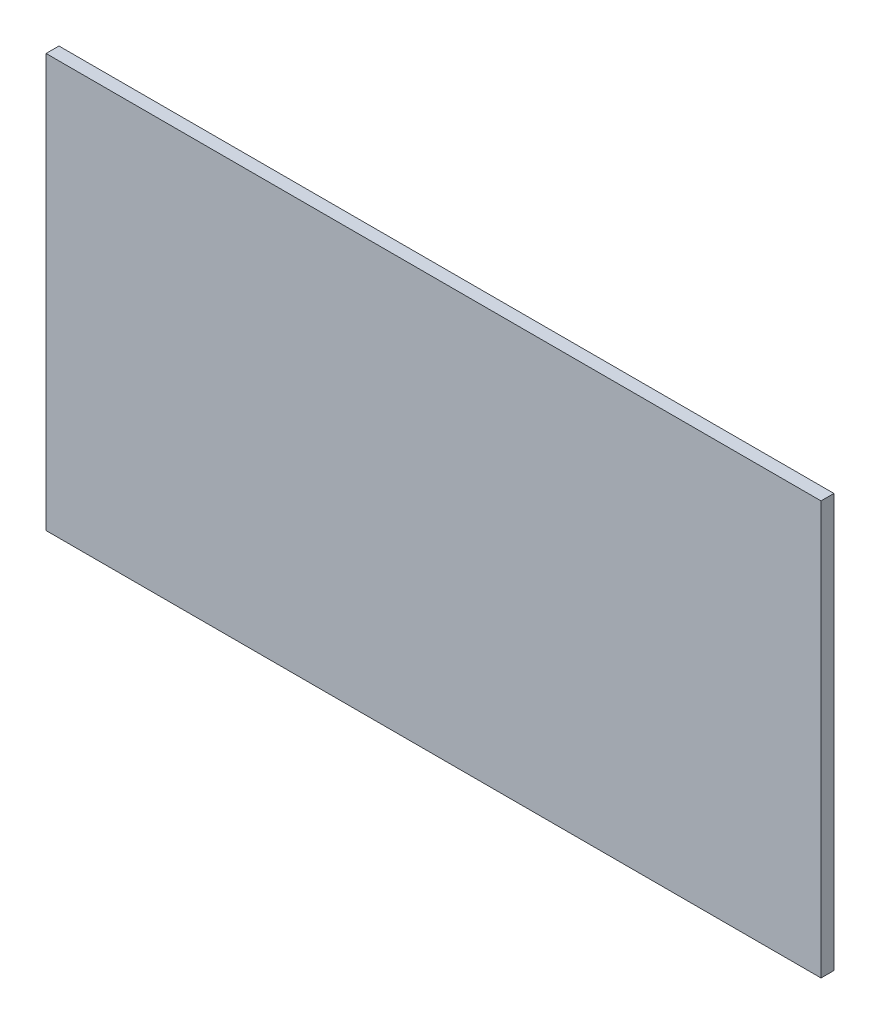
ISO-10303-21;
HEADER;
FILE_DESCRIPTION(('STEP AP214'),'2;1');
FILE_NAME('part.step','',(''),(''),'','','');
FILE_SCHEMA(('AUTOMOTIVE_DESIGN { 1 0 10303 214 1 1 1 1 }'));
ENDSEC;
DATA;
#1=APPLICATION_CONTEXT('core data for automotive mechanical design processes');
#2=APPLICATION_PROTOCOL_DEFINITION('international standard','automotive_design',2000,#1);
#3=PRODUCT_CONTEXT('',#1,'mechanical');
#4=PRODUCT('Part','Part','',(#3));
#5=PRODUCT_RELATED_PRODUCT_CATEGORY('part','',(#4));
#6=PRODUCT_DEFINITION_FORMATION('','',#4);
#7=PRODUCT_DEFINITION_CONTEXT('part definition',#1,'design');
#8=PRODUCT_DEFINITION('design','',#6,#7);
#9=PRODUCT_DEFINITION_SHAPE('','',#8);
#10=(LENGTH_UNIT() NAMED_UNIT(*) SI_UNIT(.MILLI.,.METRE.));
#11=(NAMED_UNIT(*) PLANE_ANGLE_UNIT() SI_UNIT($,.RADIAN.));
#12=(NAMED_UNIT(*) SI_UNIT($,.STERADIAN.) SOLID_ANGLE_UNIT());
#13=UNCERTAINTY_MEASURE_WITH_UNIT(LENGTH_MEASURE(1.E-05),#10,'distance_accuracy_value','');
#14=(GEOMETRIC_REPRESENTATION_CONTEXT(3) GLOBAL_UNCERTAINTY_ASSIGNED_CONTEXT((#13)) GLOBAL_UNIT_ASSIGNED_CONTEXT((#10,
#11,#12)) REPRESENTATION_CONTEXT('',''));
#15=CARTESIAN_POINT('',(0.,0.,0.));
#16=DIRECTION('',(0.,0.,1.));
#17=DIRECTION('',(1.,0.,0.));
#18=AXIS2_PLACEMENT_3D('',#15,#16,#17);
#19=CARTESIAN_POINT('',(0.,0.,0.));
#20=DIRECTION('',(0.,0.,-1.));
#21=DIRECTION('',(-1.,0.,0.));
#22=AXIS2_PLACEMENT_3D('',#19,#20,#21);
#23=PLANE('',#22);
#24=DIRECTION('',(0.,-1.,0.));
#25=VECTOR('',#24,1.);
#26=CARTESIAN_POINT('',(0.,0.,0.));
#27=LINE('',#26,#25);
#28=CARTESIAN_POINT('',(0.,80.,0.));
#29=VERTEX_POINT('',#28);
#30=CARTESIAN_POINT('',(0.,0.,0.));
#31=VERTEX_POINT('',#30);
#32=EDGE_CURVE('E134',#29,#31,#27,.T.);
#33=ORIENTED_EDGE('',*,*,#32,.F.);
#34=DIRECTION('',(-1.,0.,0.));
#35=VECTOR('',#34,1.);
#36=CARTESIAN_POINT('',(0.,80.,0.));
#37=LINE('',#36,#35);
#38=CARTESIAN_POINT('',(150.05,80.,0.));
#39=VERTEX_POINT('',#38);
#40=EDGE_CURVE('E80',#39,#29,#37,.T.);
#41=ORIENTED_EDGE('',*,*,#40,.F.);
#42=DIRECTION('',(0.,1.,0.));
#43=VECTOR('',#42,1.);
#44=CARTESIAN_POINT('',(150.05,0.,0.));
#45=LINE('',#44,#43);
#46=CARTESIAN_POINT('',(150.05,0.,0.));
#47=VERTEX_POINT('',#46);
#48=EDGE_CURVE('E150',#47,#39,#45,.T.);
#49=ORIENTED_EDGE('',*,*,#48,.F.);
#50=DIRECTION('',(1.,0.,0.));
#51=VECTOR('',#50,1.);
#52=CARTESIAN_POINT('',(0.,0.,0.));
#53=LINE('',#52,#51);
#54=EDGE_CURVE('E137',#31,#47,#53,.T.);
#55=ORIENTED_EDGE('',*,*,#54,.F.);
#56=EDGE_LOOP('',(#33,#41,#49,#55));
#57=FACE_BOUND('',#56,.T.);
#58=DIRECTION('',(1.,0.,0.));
#59=VECTOR('',#58,1.);
#60=CARTESIAN_POINT('',(60.025,16.7265474439847,0.));
#61=LINE('',#60,#59);
#62=CARTESIAN_POINT('',(60.025,16.7265474439847,0.));
#63=VERTEX_POINT('',#62);
#64=CARTESIAN_POINT('',(90.025,16.7265474439847,0.));
#65=VERTEX_POINT('',#64);
#66=EDGE_CURVE('E265',#63,#65,#61,.T.);
#67=ORIENTED_EDGE('',*,*,#66,.F.);
#68=DIRECTION('',(0.,1.,0.));
#69=VECTOR('',#68,1.);
#70=CARTESIAN_POINT('',(60.025,11.7265474439847,0.));
#71=LINE('',#70,#69);
#72=CARTESIAN_POINT('',(60.025,11.7265474439847,0.));
#73=VERTEX_POINT('',#72);
#74=EDGE_CURVE('E132',#73,#63,#71,.T.);
#75=ORIENTED_EDGE('',*,*,#74,.F.);
#76=DIRECTION('',(-1.,0.,0.));
#77=VECTOR('',#76,1.);
#78=CARTESIAN_POINT('',(60.025,11.7265474439847,0.));
#79=LINE('',#78,#77);
#80=CARTESIAN_POINT('',(90.025,11.7265474439847,0.));
#81=VERTEX_POINT('',#80);
#82=EDGE_CURVE('E128',#81,#73,#79,.T.);
#83=ORIENTED_EDGE('',*,*,#82,.F.);
#84=DIRECTION('',(0.,-1.,0.));
#85=VECTOR('',#84,1.);
#86=CARTESIAN_POINT('',(90.025,11.7265474439847,0.));
#87=LINE('',#86,#85);
#88=EDGE_CURVE('E262',#65,#81,#87,.T.);
#89=ORIENTED_EDGE('',*,*,#88,.F.);
#90=EDGE_LOOP('',(#67,#75,#83,#89));
#91=FACE_BOUND('',#90,.T.);
#92=ADVANCED_FACE('F35',(#57,#91),#23,.T.);
#93=CARTESIAN_POINT('',(0.,0.,2.5));
#94=DIRECTION('',(1.,0.,0.));
#95=DIRECTION('',(0.,0.,-1.));
#96=AXIS2_PLACEMENT_3D('',#93,#94,#95);
#97=PLANE('',#96);
#98=ORIENTED_EDGE('',*,*,#32,.T.);
#99=DIRECTION('',(0.,0.,-1.));
#100=VECTOR('',#99,1.);
#101=CARTESIAN_POINT('',(0.,0.,2.5));
#102=LINE('',#101,#100);
#103=CARTESIAN_POINT('',(0.,0.,2.5));
#104=VERTEX_POINT('',#103);
#105=EDGE_CURVE('E11',#104,#31,#102,.T.);
#106=ORIENTED_EDGE('',*,*,#105,.F.);
#107=DIRECTION('',(0.,-1.,0.));
#108=VECTOR('',#107,1.);
#109=CARTESIAN_POINT('',(0.,0.,2.5));
#110=LINE('',#109,#108);
#111=CARTESIAN_POINT('',(0.,80.,2.5));
#112=VERTEX_POINT('',#111);
#113=EDGE_CURVE('E142',#112,#104,#110,.T.);
#114=ORIENTED_EDGE('',*,*,#113,.F.);
#115=DIRECTION('',(0.,0.,-1.));
#116=VECTOR('',#115,1.);
#117=CARTESIAN_POINT('',(0.,80.,2.5));
#118=LINE('',#117,#116);
#119=EDGE_CURVE('E147',#112,#29,#118,.T.);
#120=ORIENTED_EDGE('',*,*,#119,.T.);
#121=EDGE_LOOP('',(#98,#106,#114,#120));
#122=FACE_BOUND('',#121,.T.);
#123=ADVANCED_FACE('F37',(#122),#97,.F.);
#124=CARTESIAN_POINT('',(0.,0.,2.5));
#125=DIRECTION('',(0.,1.,0.));
#126=DIRECTION('',(0.,0.,1.));
#127=AXIS2_PLACEMENT_3D('',#124,#125,#126);
#128=PLANE('',#127);
#129=ORIENTED_EDGE('',*,*,#54,.T.);
#130=DIRECTION('',(0.,0.,-1.));
#131=VECTOR('',#130,1.);
#132=CARTESIAN_POINT('',(150.05,0.,2.5));
#133=LINE('',#132,#131);
#134=CARTESIAN_POINT('',(150.05,0.,2.5));
#135=VERTEX_POINT('',#134);
#136=EDGE_CURVE('E43',#135,#47,#133,.T.);
#137=ORIENTED_EDGE('',*,*,#136,.F.);
#138=DIRECTION('',(1.,0.,0.));
#139=VECTOR('',#138,1.);
#140=CARTESIAN_POINT('',(0.,0.,2.5));
#141=LINE('',#140,#139);
#142=EDGE_CURVE('E87',#104,#135,#141,.T.);
#143=ORIENTED_EDGE('',*,*,#142,.F.);
#144=ORIENTED_EDGE('',*,*,#105,.T.);
#145=EDGE_LOOP('',(#129,#137,#143,#144));
#146=FACE_BOUND('',#145,.T.);
#147=ADVANCED_FACE('F176',(#146),#128,.F.);
#148=CARTESIAN_POINT('',(150.05,0.,2.5));
#149=DIRECTION('',(-1.,0.,0.));
#150=DIRECTION('',(0.,0.,1.));
#151=AXIS2_PLACEMENT_3D('',#148,#149,#150);
#152=PLANE('',#151);
#153=ORIENTED_EDGE('',*,*,#48,.T.);
#154=DIRECTION('',(0.,0.,-1.));
#155=VECTOR('',#154,1.);
#156=CARTESIAN_POINT('',(150.05,80.,2.5));
#157=LINE('',#156,#155);
#158=CARTESIAN_POINT('',(150.05,80.,2.5));
#159=VERTEX_POINT('',#158);
#160=EDGE_CURVE('E154',#159,#39,#157,.T.);
#161=ORIENTED_EDGE('',*,*,#160,.F.);
#162=DIRECTION('',(0.,1.,0.));
#163=VECTOR('',#162,1.);
#164=CARTESIAN_POINT('',(150.05,0.,2.5));
#165=LINE('',#164,#163);
#166=EDGE_CURVE('E145',#135,#159,#165,.T.);
#167=ORIENTED_EDGE('',*,*,#166,.F.);
#168=ORIENTED_EDGE('',*,*,#136,.T.);
#169=EDGE_LOOP('',(#153,#161,#167,#168));
#170=FACE_BOUND('',#169,.T.);
#171=ADVANCED_FACE('F159',(#170),#152,.F.);
#172=CARTESIAN_POINT('',(0.,80.,2.5));
#173=DIRECTION('',(0.,-1.,0.));
#174=DIRECTION('',(0.,0.,-1.));
#175=AXIS2_PLACEMENT_3D('',#172,#173,#174);
#176=PLANE('',#175);
#177=ORIENTED_EDGE('',*,*,#40,.T.);
#178=ORIENTED_EDGE('',*,*,#119,.F.);
#179=DIRECTION('',(-1.,0.,0.));
#180=VECTOR('',#179,1.);
#181=CARTESIAN_POINT('',(0.,80.,2.5));
#182=LINE('',#181,#180);
#183=EDGE_CURVE('E59',#159,#112,#182,.T.);
#184=ORIENTED_EDGE('',*,*,#183,.F.);
#185=ORIENTED_EDGE('',*,*,#160,.T.);
#186=EDGE_LOOP('',(#177,#178,#184,#185));
#187=FACE_BOUND('',#186,.T.);
#188=ADVANCED_FACE('F167',(#187),#176,.F.);
#189=CARTESIAN_POINT('',(0.,0.,2.5));
#190=DIRECTION('',(0.,0.,-1.));
#191=DIRECTION('',(-1.,0.,0.));
#192=AXIS2_PLACEMENT_3D('',#189,#190,#191);
#193=PLANE('',#192);
#194=ORIENTED_EDGE('',*,*,#113,.T.);
#195=ORIENTED_EDGE('',*,*,#142,.T.);
#196=ORIENTED_EDGE('',*,*,#166,.T.);
#197=ORIENTED_EDGE('',*,*,#183,.T.);
#198=EDGE_LOOP('',(#194,#195,#196,#197));
#199=FACE_BOUND('',#198,.T.);
#200=ADVANCED_FACE('F169',(#199),#193,.F.);
#201=CARTESIAN_POINT('',(60.025,11.7265474439847,-5.));
#202=DIRECTION('',(1.,0.,0.));
#203=DIRECTION('',(0.,0.,-1.));
#204=AXIS2_PLACEMENT_3D('',#201,#202,#203);
#205=PLANE('',#204);
#206=ORIENTED_EDGE('',*,*,#74,.T.);
#207=DIRECTION('',(0.,0.,1.));
#208=VECTOR('',#207,1.);
#209=CARTESIAN_POINT('',(60.025,16.7265474439847,-5.));
#210=LINE('',#209,#208);
#211=CARTESIAN_POINT('',(60.025,16.7265474439847,-5.));
#212=VERTEX_POINT('',#211);
#213=EDGE_CURVE('E113',#212,#63,#210,.T.);
#214=ORIENTED_EDGE('',*,*,#213,.F.);
#215=DIRECTION('',(0.,1.,0.));
#216=VECTOR('',#215,1.);
#217=CARTESIAN_POINT('',(60.025,11.7265474439847,-5.));
#218=LINE('',#217,#216);
#219=CARTESIAN_POINT('',(60.025,11.7265474439847,-5.));
#220=VERTEX_POINT('',#219);
#221=EDGE_CURVE('E120',#220,#212,#218,.T.);
#222=ORIENTED_EDGE('',*,*,#221,.F.);
#223=DIRECTION('',(0.,0.,1.));
#224=VECTOR('',#223,1.);
#225=CARTESIAN_POINT('',(60.025,11.7265474439847,-5.));
#226=LINE('',#225,#224);
#227=EDGE_CURVE('E260',#220,#73,#226,.T.);
#228=ORIENTED_EDGE('',*,*,#227,.T.);
#229=EDGE_LOOP('',(#206,#214,#222,#228));
#230=FACE_BOUND('',#229,.T.);
#231=ADVANCED_FACE('F130',(#230),#205,.F.);
#232=CARTESIAN_POINT('',(60.025,16.7265474439847,-5.));
#233=DIRECTION('',(0.,-1.,0.));
#234=DIRECTION('',(0.,0.,-1.));
#235=AXIS2_PLACEMENT_3D('',#232,#233,#234);
#236=PLANE('',#235);
#237=ORIENTED_EDGE('',*,*,#66,.T.);
#238=DIRECTION('',(0.,0.,1.));
#239=VECTOR('',#238,1.);
#240=CARTESIAN_POINT('',(90.025,16.7265474439847,-5.));
#241=LINE('',#240,#239);
#242=CARTESIAN_POINT('',(90.025,16.7265474439847,-5.));
#243=VERTEX_POINT('',#242);
#244=EDGE_CURVE('E116',#243,#65,#241,.T.);
#245=ORIENTED_EDGE('',*,*,#244,.F.);
#246=DIRECTION('',(1.,0.,0.));
#247=VECTOR('',#246,1.);
#248=CARTESIAN_POINT('',(60.025,16.7265474439847,-5.));
#249=LINE('',#248,#247);
#250=EDGE_CURVE('E109',#212,#243,#249,.T.);
#251=ORIENTED_EDGE('',*,*,#250,.F.);
#252=ORIENTED_EDGE('',*,*,#213,.T.);
#253=EDGE_LOOP('',(#237,#245,#251,#252));
#254=FACE_BOUND('',#253,.T.);
#255=ADVANCED_FACE('F111',(#254),#236,.F.);
#256=CARTESIAN_POINT('',(90.025,11.7265474439847,-5.));
#257=DIRECTION('',(-1.,0.,0.));
#258=DIRECTION('',(0.,0.,1.));
#259=AXIS2_PLACEMENT_3D('',#256,#257,#258);
#260=PLANE('',#259);
#261=ORIENTED_EDGE('',*,*,#88,.T.);
#262=DIRECTION('',(0.,0.,1.));
#263=VECTOR('',#262,1.);
#264=CARTESIAN_POINT('',(90.025,11.7265474439847,-5.));
#265=LINE('',#264,#263);
#266=CARTESIAN_POINT('',(90.025,11.7265474439847,-5.));
#267=VERTEX_POINT('',#266);
#268=EDGE_CURVE('E50',#267,#81,#265,.T.);
#269=ORIENTED_EDGE('',*,*,#268,.F.);
#270=DIRECTION('',(0.,-1.,0.));
#271=VECTOR('',#270,1.);
#272=CARTESIAN_POINT('',(90.025,11.7265474439847,-5.));
#273=LINE('',#272,#271);
#274=EDGE_CURVE('E119',#243,#267,#273,.T.);
#275=ORIENTED_EDGE('',*,*,#274,.F.);
#276=ORIENTED_EDGE('',*,*,#244,.T.);
#277=EDGE_LOOP('',(#261,#269,#275,#276));
#278=FACE_BOUND('',#277,.T.);
#279=ADVANCED_FACE('F190',(#278),#260,.F.);
#280=CARTESIAN_POINT('',(60.025,11.7265474439847,-5.));
#281=DIRECTION('',(0.,1.,0.));
#282=DIRECTION('',(0.,0.,1.));
#283=AXIS2_PLACEMENT_3D('',#280,#281,#282);
#284=PLANE('',#283);
#285=ORIENTED_EDGE('',*,*,#82,.T.);
#286=ORIENTED_EDGE('',*,*,#227,.F.);
#287=DIRECTION('',(-1.,0.,0.));
#288=VECTOR('',#287,1.);
#289=CARTESIAN_POINT('',(60.025,11.7265474439847,-5.));
#290=LINE('',#289,#288);
#291=EDGE_CURVE('E124',#267,#220,#290,.T.);
#292=ORIENTED_EDGE('',*,*,#291,.F.);
#293=ORIENTED_EDGE('',*,*,#268,.T.);
#294=EDGE_LOOP('',(#285,#286,#292,#293));
#295=FACE_BOUND('',#294,.T.);
#296=ADVANCED_FACE('F193',(#295),#284,.F.);
#297=CARTESIAN_POINT('',(0.,0.,-5.));
#298=DIRECTION('',(0.,0.,-1.));
#299=DIRECTION('',(-1.,0.,0.));
#300=AXIS2_PLACEMENT_3D('',#297,#298,#299);
#301=PLANE('',#300);
#302=ORIENTED_EDGE('',*,*,#221,.T.);
#303=ORIENTED_EDGE('',*,*,#250,.T.);
#304=ORIENTED_EDGE('',*,*,#274,.T.);
#305=ORIENTED_EDGE('',*,*,#291,.T.);
#306=EDGE_LOOP('',(#302,#303,#304,#305));
#307=FACE_BOUND('',#306,.T.);
#308=ADVANCED_FACE('F123',(#307),#301,.T.);
#309=CLOSED_SHELL('',(#92,#123,#147,#171,#188,#200,#231,#255,#279,#296,#308));
#310=MANIFOLD_SOLID_BREP('B2',#309);
#311=ADVANCED_BREP_SHAPE_REPRESENTATION('',(#18,#310),#14);
#312=SHAPE_DEFINITION_REPRESENTATION(#9,#311);
ENDSEC;
END-ISO-10303-21;
